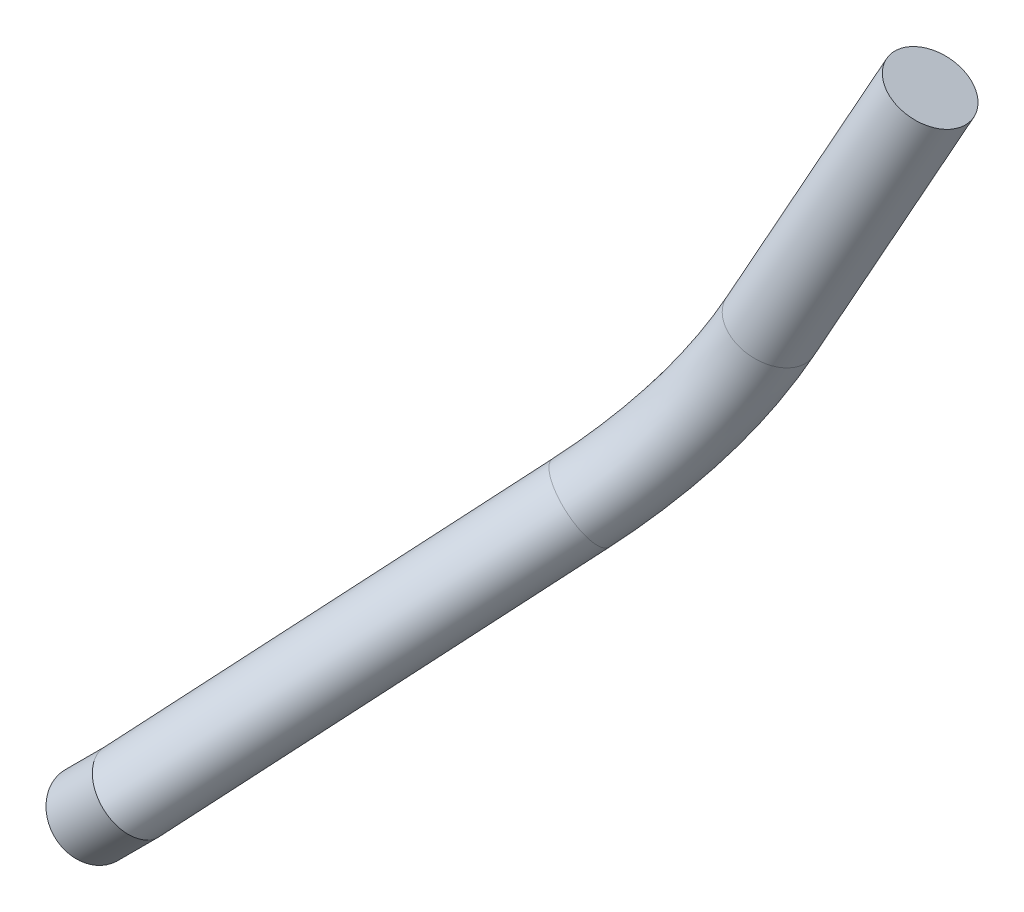
ISO-10303-21;
HEADER;
FILE_DESCRIPTION(('STEP AP214'),'2;1');
FILE_NAME('part.step','',(''),(''),'','','');
FILE_SCHEMA(('AUTOMOTIVE_DESIGN { 1 0 10303 214 1 1 1 1 }'));
ENDSEC;
DATA;
#1=APPLICATION_CONTEXT('core data for automotive mechanical design processes');
#2=APPLICATION_PROTOCOL_DEFINITION('international standard','automotive_design',2000,#1);
#3=PRODUCT_CONTEXT('',#1,'mechanical');
#4=PRODUCT('Part','Part','',(#3));
#5=PRODUCT_RELATED_PRODUCT_CATEGORY('part','',(#4));
#6=PRODUCT_DEFINITION_FORMATION('','',#4);
#7=PRODUCT_DEFINITION_CONTEXT('part definition',#1,'design');
#8=PRODUCT_DEFINITION('design','',#6,#7);
#9=PRODUCT_DEFINITION_SHAPE('','',#8);
#10=(LENGTH_UNIT() NAMED_UNIT(*) SI_UNIT(.MILLI.,.METRE.));
#11=(NAMED_UNIT(*) PLANE_ANGLE_UNIT() SI_UNIT($,.RADIAN.));
#12=(NAMED_UNIT(*) SI_UNIT($,.STERADIAN.) SOLID_ANGLE_UNIT());
#13=UNCERTAINTY_MEASURE_WITH_UNIT(LENGTH_MEASURE(1.E-05),#10,'distance_accuracy_value','');
#14=(GEOMETRIC_REPRESENTATION_CONTEXT(3) GLOBAL_UNCERTAINTY_ASSIGNED_CONTEXT((#13)) GLOBAL_UNIT_ASSIGNED_CONTEXT((#10,
#11,#12)) REPRESENTATION_CONTEXT('',''));
#15=CARTESIAN_POINT('',(0.,0.,0.));
#16=DIRECTION('',(0.,0.,1.));
#17=DIRECTION('',(1.,0.,0.));
#18=AXIS2_PLACEMENT_3D('',#15,#16,#17);
#19=CARTESIAN_POINT('',(193.010891229428,77.9168547777323,208.7608));
#20=DIRECTION('',(0.707106781186756,0.707106781186339,3.13292330996247E-13));
#21=DIRECTION('',(-0.707106781186339,0.707106781186756,0.));
#22=AXIS2_PLACEMENT_3D('',#19,#20,#21);
#23=PLANE('',#22);
#24=CARTESIAN_POINT('',(193.010891229428,77.9168547777323,208.7608));
#25=DIRECTION('',(0.707106781186756,0.707106781186339,3.13292330996247E-13));
#26=DIRECTION('',(-0.707106781186339,0.707106781186756,0.));
#27=AXIS2_PLACEMENT_3D('',#24,#25,#26);
#28=CIRCLE('',#27,4.69900000000001);
#29=CARTESIAN_POINT('',(189.688196464634,81.2395495425288,208.7608));
#30=VERTEX_POINT('',#29);
#31=EDGE_CURVE('E46',#30,#30,#28,.T.);
#32=ORIENTED_EDGE('',*,*,#31,.F.);
#33=EDGE_LOOP('',(#32));
#34=FACE_BOUND('',#33,.T.);
#35=ADVANCED_FACE('F43',(#34),#23,.F.);
#36=CARTESIAN_POINT('',(253.620262853488,165.140017683346,163.321796800787));
#37=DIRECTION('',(0.428619655044023,0.890066110551967,-0.155137068932078));
#38=DIRECTION('',(-0.884787750148492,0.448267243214211,0.127307171236739));
#39=AXIS2_PLACEMENT_3D('',#36,#37,#38);
#40=PLANE('',#39);
#41=CARTESIAN_POINT('',(253.620262853488,165.140017683346,163.321796800787));
#42=DIRECTION('',(0.428619655044023,0.890066110551967,-0.155137068932078));
#43=DIRECTION('',(-0.884787750148492,0.448267243214211,0.127307171236739));
#44=AXIS2_PLACEMENT_3D('',#41,#42,#43);
#45=CIRCLE('',#44,4.69900000000001);
#46=CARTESIAN_POINT('',(249.46264521554,167.246425459209,163.920013198429));
#47=VERTEX_POINT('',#46);
#48=EDGE_CURVE('E11',#47,#47,#45,.T.);
#49=ORIENTED_EDGE('',*,*,#48,.T.);
#50=EDGE_LOOP('',(#49));
#51=FACE_BOUND('',#50,.T.);
#52=ADVANCED_FACE('F69',(#51),#40,.T.);
#53=CARTESIAN_POINT('',(200.628540611571,85.534504159871,208.760800000004));
#54=DIRECTION('',(-0.707106781186754,-0.707106781186341,-3.21027944107266E-13));
#55=DIRECTION('',(0.707106781186341,-0.707106781186755,0.));
#56=AXIS2_PLACEMENT_3D('',#53,#54,#55);
#57=CYLINDRICAL_SURFACE('',#56,4.69900000000001);
#58=CARTESIAN_POINT('',(198.085125282214,82.9910888305151,208.760800000002));
#59=DIRECTION('',(-0.655206831817333,-0.68911242353775,0.309561101021789));
#60=DIRECTION('',(0.271450213578498,0.167646290258137,0.94773915341241));
#61=AXIS2_PLACEMENT_3D('',#58,#59,#60);
#62=ELLIPSE('',#61,4.94331201693354,4.69900000000001);
#63=CARTESIAN_POINT('',(199.426988384996,83.8198167517425,213.445770345984));
#64=VERTEX_POINT('',#63);
#65=EDGE_CURVE('E58',#64,#64,#62,.T.);
#66=ORIENTED_EDGE('',*,*,#65,.T.);
#67=EDGE_LOOP('',(#66));
#68=FACE_BOUND('',#67,.T.);
#69=ORIENTED_EDGE('',*,*,#31,.T.);
#70=EDGE_LOOP('',(#69));
#71=FACE_BOUND('',#70,.T.);
#72=ADVANCED_FACE('F66',(#68,#71),#57,.T.);
#73=CARTESIAN_POINT('',(253.620262853488,165.140017683346,163.321796800787));
#74=DIRECTION('',(-0.428619655044022,-0.890066110551969,0.15513706893207));
#75=DIRECTION('',(0.900974246616737,-0.433872569925092,0.));
#76=AXIS2_PLACEMENT_3D('',#73,#74,#75);
#77=CYLINDRICAL_SURFACE('',#76,4.69900000000001);
#78=CARTESIAN_POINT('',(238.754370819433,134.269695832898,168.702443465222));
#79=DIRECTION('',(0.428619655044023,0.890066110551967,-0.155137068932078));
#80=DIRECTION('',(-0.884787750148492,0.448267243214211,0.127307171236739));
#81=AXIS2_PLACEMENT_3D('',#78,#79,#80);
#82=CIRCLE('',#81,4.69900000000001);
#83=CARTESIAN_POINT('',(240.31776368646,132.788864141045,164.525896896137));
#84=VERTEX_POINT('',#83);
#85=EDGE_CURVE('E50',#84,#84,#82,.T.);
#86=ORIENTED_EDGE('',*,*,#85,.T.);
#87=EDGE_LOOP('',(#86));
#88=FACE_BOUND('',#87,.T.);
#89=ORIENTED_EDGE('',*,*,#48,.F.);
#90=EDGE_LOOP('',(#89));
#91=FACE_BOUND('',#90,.T.);
#92=ADVANCED_FACE('F81',(#88,#91),#77,.T.);
#93=CARTESIAN_POINT('',(221.852826311034,150.278687096171,213.854298266139));
#94=DIRECTION('',(-0.839994562362254,0.32934874712419,-0.431205911334215));
#95=DIRECTION('',(-0.456685129558831,0.,0.889628401322616));
#96=AXIS2_PLACEMENT_3D('',#93,#94,#95);
#97=TOROIDAL_SURFACE('',#96,50.8,4.69900000000001);
#98=CARTESIAN_POINT('',(225.215214034669,113.368458468325,179.112833538294));
#99=DIRECTION('',(0.538542650677155,0.603002419734615,-0.588523487378221));
#100=DIRECTION('',(-0.738523783431751,0.674064014374363,0.0148433766768233));
#101=AXIS2_PLACEMENT_3D('',#98,#99,#100);
#102=CIRCLE('',#101,4.69900000000001);
#103=CARTESIAN_POINT('',(225.526234899106,109.954262320249,175.899248050969));
#104=VERTEX_POINT('',#103);
#105=EDGE_CURVE('E55',#104,#104,#102,.T.);
#106=CARTESIAN_POINT('',(221.852826311034,150.278687096171,213.854298266139));
#107=DIRECTION('',(-0.839994562362254,0.32934874712419,-0.431205911334215));
#108=DIRECTION('',(-0.456685129558831,0.,0.889628401322616));
#109=AXIS2_PLACEMENT_3D('',#106,#107,#108);
#110=CIRCLE('',#109,55.499);
#111=EDGE_CURVE('',#84,#104,#110,.T.);
#112=ORIENTED_EDGE('',*,*,#85,.F.);
#113=ORIENTED_EDGE('',*,*,#105,.T.);
#114=ORIENTED_EDGE('',*,*,#111,.T.);
#115=ORIENTED_EDGE('',*,*,#111,.F.);
#116=EDGE_LOOP('',(#112,#114,#113,#115));
#117=FACE_BOUND('',#116,.T.);
#118=ADVANCED_FACE('F75',(#117),#97,.T.);
#119=CARTESIAN_POINT('',(225.215214034669,113.368458468325,179.112833538294));
#120=DIRECTION('',(-0.538542650677156,-0.60300241973462,0.588523487378215));
#121=DIRECTION('',(0.,-0.698462744662284,-0.715646417107519));
#122=AXIS2_PLACEMENT_3D('',#119,#120,#121);
#123=CYLINDRICAL_SURFACE('',#122,4.69900000000001);
#124=ORIENTED_EDGE('',*,*,#105,.F.);
#125=EDGE_LOOP('',(#124));
#126=FACE_BOUND('',#125,.T.);
#127=ORIENTED_EDGE('',*,*,#65,.F.);
#128=EDGE_LOOP('',(#127));
#129=FACE_BOUND('',#128,.T.);
#130=ADVANCED_FACE('F73',(#126,#129),#123,.T.);
#131=CLOSED_SHELL('',(#35,#52,#72,#92,#118,#130));
#132=MANIFOLD_SOLID_BREP('B2',#131);
#133=ADVANCED_BREP_SHAPE_REPRESENTATION('',(#18,#132),#14);
#134=SHAPE_DEFINITION_REPRESENTATION(#9,#133);
ENDSEC;
END-ISO-10303-21;
